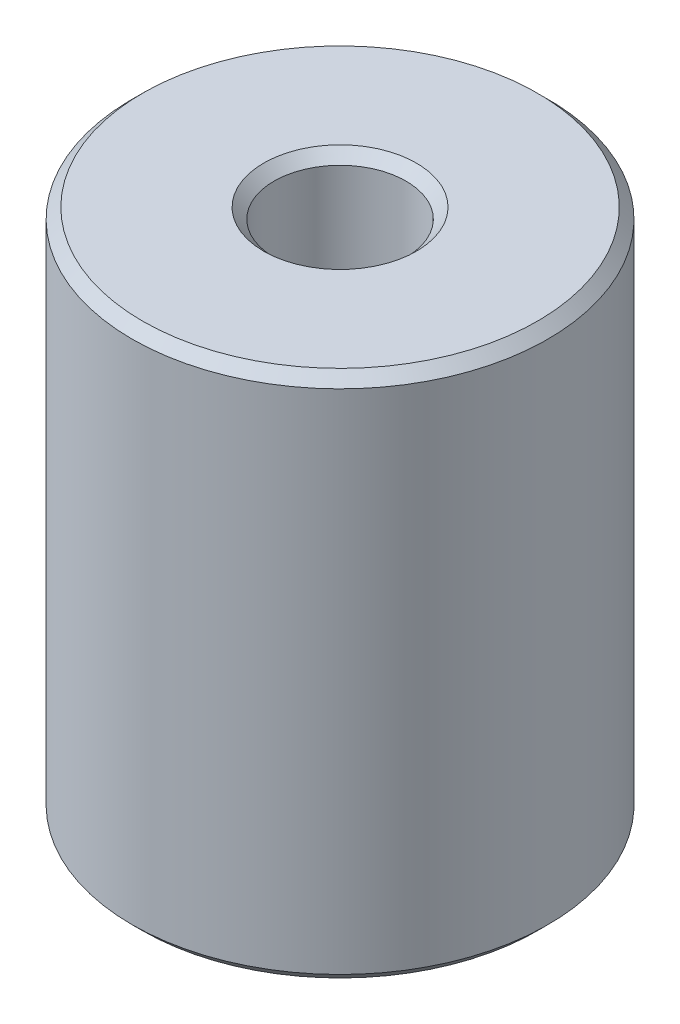
ISO-10303-21;
HEADER;
FILE_DESCRIPTION(('STEP AP214'),'2;1');
FILE_NAME('part.step','',(''),(''),'','','');
FILE_SCHEMA(('AUTOMOTIVE_DESIGN { 1 0 10303 214 1 1 1 1 }'));
ENDSEC;
DATA;
#1=APPLICATION_CONTEXT('core data for automotive mechanical design processes');
#2=APPLICATION_PROTOCOL_DEFINITION('international standard','automotive_design',2000,#1);
#3=PRODUCT_CONTEXT('',#1,'mechanical');
#4=PRODUCT('Part','Part','',(#3));
#5=PRODUCT_RELATED_PRODUCT_CATEGORY('part','',(#4));
#6=PRODUCT_DEFINITION_FORMATION('','',#4);
#7=PRODUCT_DEFINITION_CONTEXT('part definition',#1,'design');
#8=PRODUCT_DEFINITION('design','',#6,#7);
#9=PRODUCT_DEFINITION_SHAPE('','',#8);
#10=(LENGTH_UNIT() NAMED_UNIT(*) SI_UNIT(.MILLI.,.METRE.));
#11=(NAMED_UNIT(*) PLANE_ANGLE_UNIT() SI_UNIT($,.RADIAN.));
#12=(NAMED_UNIT(*) SI_UNIT($,.STERADIAN.) SOLID_ANGLE_UNIT());
#13=UNCERTAINTY_MEASURE_WITH_UNIT(LENGTH_MEASURE(1.E-05),#10,'distance_accuracy_value','');
#14=(GEOMETRIC_REPRESENTATION_CONTEXT(3) GLOBAL_UNCERTAINTY_ASSIGNED_CONTEXT((#13)) GLOBAL_UNIT_ASSIGNED_CONTEXT((#10,
#11,#12)) REPRESENTATION_CONTEXT('',''));
#15=CARTESIAN_POINT('',(0.,0.,0.));
#16=DIRECTION('',(0.,0.,1.));
#17=DIRECTION('',(1.,0.,0.));
#18=AXIS2_PLACEMENT_3D('',#15,#16,#17);
#19=CARTESIAN_POINT('',(0.,25.4,0.));
#20=DIRECTION('',(0.,-1.,0.));
#21=DIRECTION('',(0.,0.,-1.));
#22=AXIS2_PLACEMENT_3D('',#19,#20,#21);
#23=CYLINDRICAL_SURFACE('',#22,10.);
#24=CARTESIAN_POINT('',(0.,0.5,0.));
#25=DIRECTION('',(0.,1.,0.));
#26=DIRECTION('',(0.,0.,1.));
#27=AXIS2_PLACEMENT_3D('',#24,#25,#26);
#28=CIRCLE('',#27,10.);
#29=CARTESIAN_POINT('',(0.,0.5,10.));
#30=VERTEX_POINT('',#29);
#31=EDGE_CURVE('E40',#30,#30,#28,.T.);
#32=ORIENTED_EDGE('',*,*,#31,.T.);
#33=EDGE_LOOP('',(#32));
#34=FACE_BOUND('',#33,.T.);
#35=CARTESIAN_POINT('',(0.,24.9,0.));
#36=DIRECTION('',(0.,1.,0.));
#37=DIRECTION('',(0.,0.,1.));
#38=AXIS2_PLACEMENT_3D('',#35,#36,#37);
#39=CIRCLE('',#38,10.);
#40=CARTESIAN_POINT('',(0.,24.9,10.));
#41=VERTEX_POINT('',#40);
#42=EDGE_CURVE('E44',#41,#41,#39,.F.);
#43=ORIENTED_EDGE('',*,*,#42,.T.);
#44=EDGE_LOOP('',(#43));
#45=FACE_BOUND('',#44,.T.);
#46=ADVANCED_FACE('F33',(#34,#45),#23,.T.);
#47=CARTESIAN_POINT('',(0.,25.4,0.));
#48=DIRECTION('',(0.,1.,0.));
#49=DIRECTION('',(0.,0.,1.));
#50=AXIS2_PLACEMENT_3D('',#47,#48,#49);
#51=PLANE('',#50);
#52=CARTESIAN_POINT('',(0.,25.4,0.));
#53=DIRECTION('',(0.,1.,0.));
#54=DIRECTION('',(0.,0.,1.));
#55=AXIS2_PLACEMENT_3D('',#52,#53,#54);
#56=CIRCLE('',#55,3.67500000000001);
#57=CARTESIAN_POINT('',(0.,25.4,3.67500000000001));
#58=VERTEX_POINT('',#57);
#59=EDGE_CURVE('E48',#58,#58,#56,.F.);
#60=ORIENTED_EDGE('',*,*,#59,.T.);
#61=EDGE_LOOP('',(#60));
#62=FACE_BOUND('',#61,.T.);
#63=CARTESIAN_POINT('',(0.,25.4,0.));
#64=DIRECTION('',(0.,1.,0.));
#65=DIRECTION('',(0.,0.,1.));
#66=AXIS2_PLACEMENT_3D('',#63,#64,#65);
#67=CIRCLE('',#66,9.49999999999999);
#68=CARTESIAN_POINT('',(0.,25.4,9.49999999999999));
#69=VERTEX_POINT('',#68);
#70=EDGE_CURVE('E53',#69,#69,#67,.T.);
#71=ORIENTED_EDGE('',*,*,#70,.T.);
#72=EDGE_LOOP('',(#71));
#73=FACE_BOUND('',#72,.T.);
#74=ADVANCED_FACE('F81',(#62,#73),#51,.T.);
#75=CARTESIAN_POINT('',(0.,0.,0.));
#76=DIRECTION('',(0.,1.,0.));
#77=DIRECTION('',(0.,0.,1.));
#78=AXIS2_PLACEMENT_3D('',#75,#76,#77);
#79=PLANE('',#78);
#80=CARTESIAN_POINT('',(0.,0.,0.));
#81=DIRECTION('',(0.,-1.,0.));
#82=DIRECTION('',(0.,0.,-1.));
#83=AXIS2_PLACEMENT_3D('',#80,#81,#82);
#84=CIRCLE('',#83,4.);
#85=CARTESIAN_POINT('',(0.,0.,-4.));
#86=VERTEX_POINT('',#85);
#87=EDGE_CURVE('E63',#86,#86,#84,.T.);
#88=ORIENTED_EDGE('',*,*,#87,.F.);
#89=EDGE_LOOP('',(#88));
#90=FACE_BOUND('',#89,.T.);
#91=CARTESIAN_POINT('',(0.,0.,0.));
#92=DIRECTION('',(0.,1.,0.));
#93=DIRECTION('',(0.,0.,1.));
#94=AXIS2_PLACEMENT_3D('',#91,#92,#93);
#95=CIRCLE('',#94,9.5);
#96=CARTESIAN_POINT('',(0.,0.,9.5));
#97=VERTEX_POINT('',#96);
#98=EDGE_CURVE('E10',#97,#97,#95,.F.);
#99=ORIENTED_EDGE('',*,*,#98,.T.);
#100=EDGE_LOOP('',(#99));
#101=FACE_BOUND('',#100,.T.);
#102=ADVANCED_FACE('F78',(#90,#101),#79,.F.);
#103=CARTESIAN_POINT('',(0.,12.7,0.));
#104=DIRECTION('',(0.,1.,0.));
#105=DIRECTION('',(0.,0.,1.));
#106=AXIS2_PLACEMENT_3D('',#103,#104,#105);
#107=CYLINDRICAL_SURFACE('',#106,3.175);
#108=CARTESIAN_POINT('',(0.,24.9,0.));
#109=DIRECTION('',(0.,1.,0.));
#110=DIRECTION('',(0.,0.,1.));
#111=AXIS2_PLACEMENT_3D('',#108,#109,#110);
#112=CIRCLE('',#111,3.175);
#113=CARTESIAN_POINT('',(0.,24.9,3.175));
#114=VERTEX_POINT('',#113);
#115=EDGE_CURVE('E56',#114,#114,#112,.T.);
#116=ORIENTED_EDGE('',*,*,#115,.T.);
#117=EDGE_LOOP('',(#116));
#118=FACE_BOUND('',#117,.T.);
#119=CARTESIAN_POINT('',(0.,12.7,0.));
#120=DIRECTION('',(0.,-1.,0.));
#121=DIRECTION('',(0.,0.,-1.));
#122=AXIS2_PLACEMENT_3D('',#119,#120,#121);
#123=CIRCLE('',#122,3.175);
#124=CARTESIAN_POINT('',(0.,12.7,-3.175));
#125=VERTEX_POINT('',#124);
#126=EDGE_CURVE('E59',#125,#125,#123,.F.);
#127=ORIENTED_EDGE('',*,*,#126,.F.);
#128=EDGE_LOOP('',(#127));
#129=FACE_BOUND('',#128,.T.);
#130=ADVANCED_FACE('F80',(#118,#129),#107,.F.);
#131=CARTESIAN_POINT('',(0.,24.9,0.));
#132=DIRECTION('',(0.,1.,0.));
#133=DIRECTION('',(0.,0.,1.));
#134=AXIS2_PLACEMENT_3D('',#131,#132,#133);
#135=CONICAL_SURFACE('',#134,3.175,0.785398163397456);
#136=ORIENTED_EDGE('',*,*,#59,.F.);
#137=EDGE_LOOP('',(#136));
#138=FACE_BOUND('',#137,.T.);
#139=ORIENTED_EDGE('',*,*,#115,.F.);
#140=EDGE_LOOP('',(#139));
#141=FACE_BOUND('',#140,.T.);
#142=ADVANCED_FACE('F87',(#138,#141),#135,.F.);
#143=CARTESIAN_POINT('',(0.,0.5,0.));
#144=DIRECTION('',(0.,1.,0.));
#145=DIRECTION('',(0.,0.,1.));
#146=AXIS2_PLACEMENT_3D('',#143,#144,#145);
#147=CONICAL_SURFACE('',#146,10.,0.78539816339745);
#148=ORIENTED_EDGE('',*,*,#98,.F.);
#149=EDGE_LOOP('',(#148));
#150=FACE_BOUND('',#149,.T.);
#151=ORIENTED_EDGE('',*,*,#31,.F.);
#152=EDGE_LOOP('',(#151));
#153=FACE_BOUND('',#152,.T.);
#154=ADVANCED_FACE('F99',(#150,#153),#147,.T.);
#155=CARTESIAN_POINT('',(0.,25.4,0.));
#156=DIRECTION('',(0.,-1.,0.));
#157=DIRECTION('',(0.,0.,-1.));
#158=AXIS2_PLACEMENT_3D('',#155,#156,#157);
#159=CONICAL_SURFACE('',#158,9.49999999999999,0.785398163397447);
#160=ORIENTED_EDGE('',*,*,#42,.F.);
#161=EDGE_LOOP('',(#160));
#162=FACE_BOUND('',#161,.T.);
#163=ORIENTED_EDGE('',*,*,#70,.F.);
#164=EDGE_LOOP('',(#163));
#165=FACE_BOUND('',#164,.T.);
#166=ADVANCED_FACE('F35',(#162,#165),#159,.T.);
#167=CARTESIAN_POINT('',(0.,12.7,0.));
#168=DIRECTION('',(0.,-1.,0.));
#169=DIRECTION('',(0.,0.,-1.));
#170=AXIS2_PLACEMENT_3D('',#167,#168,#169);
#171=PLANE('',#170);
#172=CARTESIAN_POINT('',(0.,12.7,0.));
#173=DIRECTION('',(0.,-1.,0.));
#174=DIRECTION('',(0.,0.,-1.));
#175=AXIS2_PLACEMENT_3D('',#172,#173,#174);
#176=CIRCLE('',#175,4.);
#177=CARTESIAN_POINT('',(0.,12.7,-4.));
#178=VERTEX_POINT('',#177);
#179=EDGE_CURVE('E62',#178,#178,#176,.T.);
#180=ORIENTED_EDGE('',*,*,#179,.T.);
#181=EDGE_LOOP('',(#180));
#182=FACE_BOUND('',#181,.T.);
#183=ORIENTED_EDGE('',*,*,#126,.T.);
#184=EDGE_LOOP('',(#183));
#185=FACE_BOUND('',#184,.T.);
#186=ADVANCED_FACE('F69',(#182,#185),#171,.T.);
#187=CARTESIAN_POINT('',(0.,12.7,0.));
#188=DIRECTION('',(0.,-1.,0.));
#189=DIRECTION('',(0.,0.,-1.));
#190=AXIS2_PLACEMENT_3D('',#187,#188,#189);
#191=CYLINDRICAL_SURFACE('',#190,4.);
#192=ORIENTED_EDGE('',*,*,#179,.F.);
#193=EDGE_LOOP('',(#192));
#194=FACE_BOUND('',#193,.T.);
#195=ORIENTED_EDGE('',*,*,#87,.T.);
#196=EDGE_LOOP('',(#195));
#197=FACE_BOUND('',#196,.T.);
#198=ADVANCED_FACE('F72',(#194,#197),#191,.F.);
#199=CLOSED_SHELL('',(#46,#74,#102,#130,#142,#154,#166,#186,#198));
#200=MANIFOLD_SOLID_BREP('B2',#199);
#201=ADVANCED_BREP_SHAPE_REPRESENTATION('',(#18,#200),#14);
#202=SHAPE_DEFINITION_REPRESENTATION(#9,#201);
ENDSEC;
END-ISO-10303-21;
